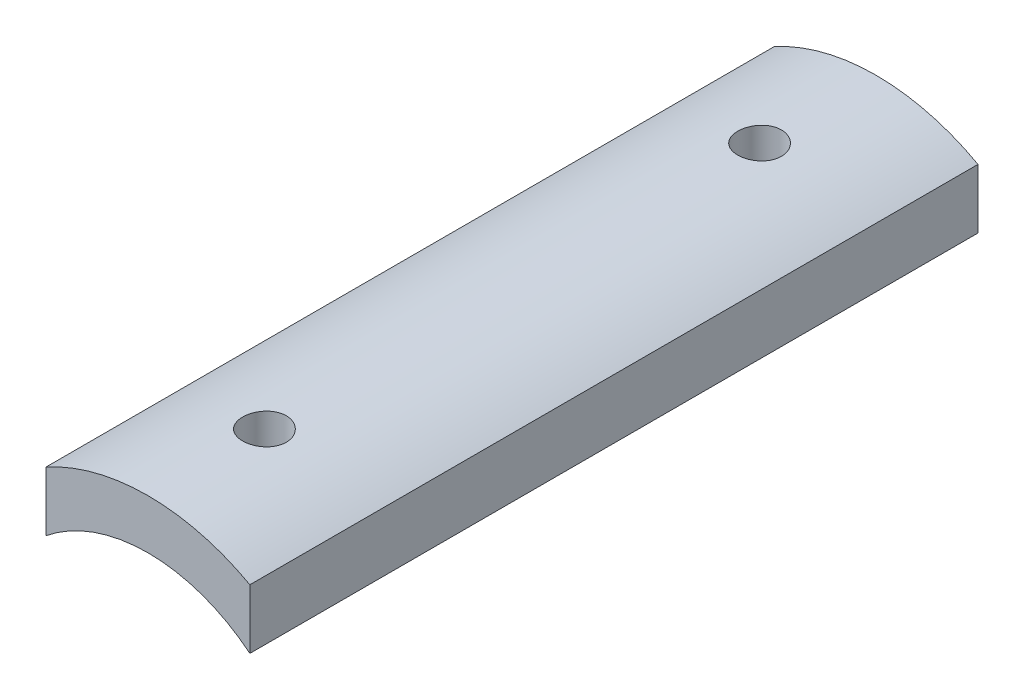
ISO-10303-21;
HEADER;
FILE_DESCRIPTION(('STEP AP214'),'2;1');
FILE_NAME('part.step','',(''),(''),'','','');
FILE_SCHEMA(('AUTOMOTIVE_DESIGN { 1 0 10303 214 1 1 1 1 }'));
ENDSEC;
DATA;
#1=APPLICATION_CONTEXT('core data for automotive mechanical design processes');
#2=APPLICATION_PROTOCOL_DEFINITION('international standard','automotive_design',2000,#1);
#3=PRODUCT_CONTEXT('',#1,'mechanical');
#4=PRODUCT('Part','Part','',(#3));
#5=PRODUCT_RELATED_PRODUCT_CATEGORY('part','',(#4));
#6=PRODUCT_DEFINITION_FORMATION('','',#4);
#7=PRODUCT_DEFINITION_CONTEXT('part definition',#1,'design');
#8=PRODUCT_DEFINITION('design','',#6,#7);
#9=PRODUCT_DEFINITION_SHAPE('','',#8);
#10=(LENGTH_UNIT() NAMED_UNIT(*) SI_UNIT(.MILLI.,.METRE.));
#11=(NAMED_UNIT(*) PLANE_ANGLE_UNIT() SI_UNIT($,.RADIAN.));
#12=(NAMED_UNIT(*) SI_UNIT($,.STERADIAN.) SOLID_ANGLE_UNIT());
#13=UNCERTAINTY_MEASURE_WITH_UNIT(LENGTH_MEASURE(1.E-05),#10,'distance_accuracy_value','');
#14=(GEOMETRIC_REPRESENTATION_CONTEXT(3) GLOBAL_UNCERTAINTY_ASSIGNED_CONTEXT((#13)) GLOBAL_UNIT_ASSIGNED_CONTEXT((#10,
#11,#12)) REPRESENTATION_CONTEXT('',''));
#15=CARTESIAN_POINT('',(0.,0.,0.));
#16=DIRECTION('',(0.,0.,1.));
#17=DIRECTION('',(1.,0.,0.));
#18=AXIS2_PLACEMENT_3D('',#15,#16,#17);
#19=CARTESIAN_POINT('',(0.,0.,50.));
#20=DIRECTION('',(0.,0.,-1.));
#21=DIRECTION('',(-1.,0.,0.));
#22=AXIS2_PLACEMENT_3D('',#19,#20,#21);
#23=CYLINDRICAL_SURFACE('',#22,14.5);
#24=CARTESIAN_POINT('',(0.,0.,0.));
#25=DIRECTION('',(0.,0.,1.));
#26=DIRECTION('',(1.,0.,0.));
#27=AXIS2_PLACEMENT_3D('',#24,#25,#26);
#28=CIRCLE('',#27,14.5);
#29=CARTESIAN_POINT('',(6.99999999999999,12.6984250992003,0.));
#30=VERTEX_POINT('',#29);
#31=CARTESIAN_POINT('',(-7.00000000000001,12.6984250992003,0.));
#32=VERTEX_POINT('',#31);
#33=EDGE_CURVE('E106',#30,#32,#28,.T.);
#34=ORIENTED_EDGE('',*,*,#33,.T.);
#35=DIRECTION('',(0.,0.,-1.));
#36=VECTOR('',#35,1.);
#37=CARTESIAN_POINT('',(-7.00000000000001,12.6984250992003,50.));
#38=LINE('',#37,#36);
#39=CARTESIAN_POINT('',(-7.00000000000001,12.6984250992003,50.));
#40=VERTEX_POINT('',#39);
#41=EDGE_CURVE('E11',#40,#32,#38,.T.);
#42=ORIENTED_EDGE('',*,*,#41,.F.);
#43=CARTESIAN_POINT('',(0.,0.,50.));
#44=DIRECTION('',(0.,0.,1.));
#45=DIRECTION('',(1.,0.,0.));
#46=AXIS2_PLACEMENT_3D('',#43,#44,#45);
#47=CIRCLE('',#46,14.5);
#48=CARTESIAN_POINT('',(6.99999999999999,12.6984250992003,50.));
#49=VERTEX_POINT('',#48);
#50=EDGE_CURVE('E92',#49,#40,#47,.T.);
#51=ORIENTED_EDGE('',*,*,#50,.F.);
#52=DIRECTION('',(0.,0.,-1.));
#53=VECTOR('',#52,1.);
#54=CARTESIAN_POINT('',(6.99999999999999,12.6984250992003,50.));
#55=LINE('',#54,#53);
#56=EDGE_CURVE('E102',#49,#30,#55,.T.);
#57=ORIENTED_EDGE('',*,*,#56,.T.);
#58=EDGE_LOOP('',(#34,#42,#51,#57));
#59=FACE_BOUND('',#58,.T.);
#60=CARTESIAN_POINT('',(0.,14.5,40.5));
#61=CARTESIAN_POINT('',(-0.0840148021741446,14.4999990032491,40.5000036303681));
#62=CARTESIAN_POINT('',(-0.168084771282427,14.4992620586649,40.5070822560206));
#63=CARTESIAN_POINT('',(-0.333892883933664,14.4963931068318,40.5352128131051));
#64=CARTESIAN_POINT('',(-0.415628372949498,14.4942595726645,40.5562800389061));
#65=CARTESIAN_POINT('',(-0.574342532597328,14.4888382191004,40.6117669932428));
#66=CARTESIAN_POINT('',(-0.651324084032495,14.4855511069859,40.6461785414556));
#67=CARTESIAN_POINT('',(-0.798402236017979,14.4781899081878,40.7273611796393));
#68=CARTESIAN_POINT('',(-0.868500178356104,14.4741159753365,40.774129854311));
#69=CARTESIAN_POINT('',(-1.00010681095366,14.465619822026,40.8788916628825));
#70=CARTESIAN_POINT('',(-1.06158536014861,14.4611964599843,40.9369225723858));
#71=CARTESIAN_POINT('',(-1.17394892441817,14.4525093984958,41.0624809009353));
#72=CARTESIAN_POINT('',(-1.22483344358428,14.4482457065309,41.130008764288));
#73=CARTESIAN_POINT('',(-1.31467204769526,14.4403491347822,41.272833793646));
#74=CARTESIAN_POINT('',(-1.35359872412229,14.4367177123463,41.3481482874149));
#75=CARTESIAN_POINT('',(-1.41824164496559,14.4305111289699,41.5042886562265));
#76=CARTESIAN_POINT('',(-1.44395823731332,14.4279359402104,41.5851143860489));
#77=CARTESIAN_POINT('',(-1.48136131906886,14.4241438023454,41.749674680786));
#78=CARTESIAN_POINT('',(-1.49309793186402,14.422922001954,41.8333977394261));
#79=CARTESIAN_POINT('',(-1.50236285600847,14.421959947576,42.001633571609));
#80=CARTESIAN_POINT('',(-1.49989156540124,14.4222196520842,42.0861463229618));
#81=CARTESIAN_POINT('',(-1.48085212496077,14.4241868324816,42.2532165454848));
#82=CARTESIAN_POINT('',(-1.46433876304795,14.4258886814695,42.3357803359061));
#83=CARTESIAN_POINT('',(-1.4177692117002,14.4305396081235,42.4969582916968));
#84=CARTESIAN_POINT('',(-1.38771282778534,14.4334887037002,42.5755724003302));
#85=CARTESIAN_POINT('',(-1.31485014657386,14.4403082989242,42.7267921400184));
#86=CARTESIAN_POINT('',(-1.27201960425428,14.444180547863,42.7993860069221));
#87=CARTESIAN_POINT('',(-1.17484181974967,14.4524086830009,42.9363758349649));
#88=CARTESIAN_POINT('',(-1.12049421672575,14.4567645843512,43.0007715391477));
#89=CARTESIAN_POINT('',(-1.00151933128955,14.4654942918335,43.119855409761));
#90=CARTESIAN_POINT('',(-0.936844744019752,14.4698680854442,43.1744963266817));
#91=CARTESIAN_POINT('',(-0.799215851694551,14.4781213717037,43.2721531390179));
#92=CARTESIAN_POINT('',(-0.72626153633905,14.4820008637376,43.3151690199715));
#93=CARTESIAN_POINT('',(-0.574110894425456,14.4888298378301,43.3883530423487));
#94=CARTESIAN_POINT('',(-0.494913372579218,14.4917791412571,43.4185187164322));
#95=CARTESIAN_POINT('',(-0.332540189971191,14.4964136379257,43.4651110451454));
#96=CARTESIAN_POINT('',(-0.249364656636167,14.4980988716301,43.4815381395489));
#97=CARTESIAN_POINT('',(-0.081805601078329,14.5000101429514,43.5001269002561));
#98=CARTESIAN_POINT('',(0.00257061651872,14.5002428483428,43.5023537532332));
#99=CARTESIAN_POINT('',(0.170495054722027,14.4992407379809,43.4926501321471));
#100=CARTESIAN_POINT('',(0.254043287295834,14.4980059434699,43.4807198630103));
#101=CARTESIAN_POINT('',(0.417751455966306,14.4942118371191,43.4430947439817));
#102=CARTESIAN_POINT('',(0.497918497033814,14.4916554694625,43.4174304860408));
#103=CARTESIAN_POINT('',(0.652809663791429,14.4855049280238,43.3530973878317));
#104=CARTESIAN_POINT('',(0.727533659325789,14.481910729435,43.3144282367108));
#105=CARTESIAN_POINT('',(0.869711877428812,14.4740697722264,43.2250218584248));
#106=CARTESIAN_POINT('',(0.937139091398134,14.4698207214891,43.1742418851988));
#107=CARTESIAN_POINT('',(1.06253616694867,14.4611540091607,43.0621165076298));
#108=CARTESIAN_POINT('',(1.12050577410416,14.4567363430375,43.0007708191422));
#109=CARTESIAN_POINT('',(1.22556904918976,14.4482101718382,42.8689706138183));
#110=CARTESIAN_POINT('',(1.27261988038123,14.4441029256992,42.7984818571161));
#111=CARTESIAN_POINT('',(1.35421534328635,14.4366819790703,42.650564970184));
#112=CARTESIAN_POINT('',(1.3887601563391,14.4333682670743,42.5731369405949));
#113=CARTESIAN_POINT('',(1.44429156258438,14.4279175313779,42.4136852235977));
#114=CARTESIAN_POINT('',(1.46530347606679,14.4257783112962,42.3316704325602));
#115=CARTESIAN_POINT('',(1.49325471535208,14.4229120132457,42.1652535334734));
#116=CARTESIAN_POINT('',(1.50019447567214,14.4221848916743,42.0808514992187));
#117=CARTESIAN_POINT('',(1.49979814281966,14.4222260798376,41.912481786088));
#118=CARTESIAN_POINT('',(1.49252933994875,14.4229873407488,41.8285139390021));
#119=CARTESIAN_POINT('',(1.46406347968093,14.4259044734943,41.6629991890778));
#120=CARTESIAN_POINT('',(1.44286640811144,14.4280603467476,41.5814522887028));
#121=CARTESIAN_POINT('',(1.387164604834,14.4335218078673,41.4230958210283));
#122=CARTESIAN_POINT('',(1.35266201080536,14.4368272110406,41.3462854950438));
#123=CARTESIAN_POINT('',(1.27133543901311,14.444215661305,41.1995352232494));
#124=CARTESIAN_POINT('',(1.22451150198588,14.4482987058251,41.129595254726));
#125=CARTESIAN_POINT('',(1.11961898310018,14.4568055537228,40.9982262238133));
#126=CARTESIAN_POINT('',(1.06150023629107,14.4612308222155,40.9368373096196));
#127=CARTESIAN_POINT('',(0.935768193350421,14.4699101648942,40.8246545220018));
#128=CARTESIAN_POINT('',(0.868152631185756,14.4741641979092,40.7738631844737));
#129=CARTESIAN_POINT('',(0.725147009600981,14.4820336925439,40.684209137661));
#130=CARTESIAN_POINT('',(0.649736651411111,14.4856474168098,40.645378677565));
#131=CARTESIAN_POINT('',(0.493476006261703,14.4918104578477,40.5809838469406));
#132=CARTESIAN_POINT('',(0.412631941056893,14.4943609687084,40.555404586186));
#133=CARTESIAN_POINT('',(0.276112419081801,14.4974725714572,40.5245848613522));
#134=CARTESIAN_POINT('',(0.2213083099583,14.4984159130774,40.5153782153079));
#135=CARTESIAN_POINT('',(0.111010828300255,14.4996799552804,40.5030845988855));
#136=CARTESIAN_POINT('',(0.0555174588614052,14.5000006586587,40.4999976010321));
#137=CARTESIAN_POINT('',(0.,14.5,40.5));
#138=B_SPLINE_CURVE_WITH_KNOTS('',3,(#60,#61,#62,#63,#64,#65,#66,#67,#68,#69,#70,#71,#72,#73,
#74,#75,#76,#77,#78,#79,#80,#81,#82,#83,#84,#85,#86,#87,#88,#89,#90,#91,#92,#93,#94,#95,#96,#97,
#98,#99,#100,#101,#102,#103,#104,#105,#106,#107,#108,#109,#110,#111,#112,#113,#114,#115,#116,
#117,#118,#119,#120,#121,#122,#123,#124,#125,#126,#127,#128,#129,#130,#131,#132,#133,#134,#135,
#136,#137),.UNSPECIFIED.,.T.,.F.,(4,2,2,2,2,2,2,2,2,2,2,2,2,2,2,2,2,2,2,2,2,2,2,2,2,2,2,2,2,2,2,
2,2,2,2,2,2,2,4),(0.,0.251841670392661,0.503959145064459,0.755922310639377,1.00783626438468,
1.26061026177495,1.51339608890355,1.76675707489008,2.02011138743097,2.27255457045027,
2.52499068114734,2.77644635791211,3.02790564573512,3.27984526731005,3.53179278352591,
3.78492937718262,4.0380662857481,4.2912517766954,4.54442916283254,4.79644348815328,
5.04845416557553,5.29990582094917,5.55136348713816,5.80372218105623,6.05608766273409,
6.30942709440746,6.56276285247463,6.81562322728749,7.06847579420858,7.32013377815423,
7.57179201817242,7.82340984334446,8.07502683663736,8.32778801717829,8.58060961179688,
8.83410702060342,9.08731895590207,9.25373811047238,9.42015651786956),.UNSPECIFIED.);
#139=CARTESIAN_POINT('',(0.,14.5,40.5));
#140=VERTEX_POINT('',#139);
#141=EDGE_CURVE('E120',#140,#140,#138,.T.);
#142=ORIENTED_EDGE('',*,*,#141,.F.);
#143=EDGE_LOOP('',(#142));
#144=FACE_BOUND('',#143,.T.);
#145=CARTESIAN_POINT('',(0.,14.5,6.5));
#146=CARTESIAN_POINT('',(-0.0840148021741486,14.4999990032491,6.50000363036809));
#147=CARTESIAN_POINT('',(-0.168084771282431,14.4992620586649,6.50708225602059));
#148=CARTESIAN_POINT('',(-0.333892883933668,14.4963931068318,6.53521281310508));
#149=CARTESIAN_POINT('',(-0.415628372949501,14.4942595726645,6.55628003890612));
#150=CARTESIAN_POINT('',(-0.574342532597331,14.4888382191004,6.61176699324282));
#151=CARTESIAN_POINT('',(-0.651324084032498,14.4855511069859,6.64617854145565));
#152=CARTESIAN_POINT('',(-0.798402236017983,14.4781899081878,6.72736117963933));
#153=CARTESIAN_POINT('',(-0.868500178356108,14.4741159753365,6.77412985431105));
#154=CARTESIAN_POINT('',(-1.00010681095367,14.465619822026,6.87889166288246));
#155=CARTESIAN_POINT('',(-1.06158536014862,14.4611964599843,6.93692257238575));
#156=CARTESIAN_POINT('',(-1.17394892441817,14.4525093984958,7.06248090093532));
#157=CARTESIAN_POINT('',(-1.22483344358428,14.4482457065309,7.13000876428796));
#158=CARTESIAN_POINT('',(-1.31467204769527,14.4403491347822,7.272833793646));
#159=CARTESIAN_POINT('',(-1.3535987241223,14.4367177123463,7.34814828741489));
#160=CARTESIAN_POINT('',(-1.4182416449656,14.4305111289699,7.50428865622646));
#161=CARTESIAN_POINT('',(-1.44395823731333,14.4279359402104,7.5851143860489));
#162=CARTESIAN_POINT('',(-1.48136131906887,14.4241438023454,7.74967468078603));
#163=CARTESIAN_POINT('',(-1.49309793186402,14.422922001954,7.83339773942608));
#164=CARTESIAN_POINT('',(-1.50236285600847,14.421959947576,8.00163357160897));
#165=CARTESIAN_POINT('',(-1.49989156540124,14.4222196520842,8.08614632296183));
#166=CARTESIAN_POINT('',(-1.48085212496077,14.4241868324816,8.25321654548478));
#167=CARTESIAN_POINT('',(-1.46433876304796,14.4258886814695,8.33578033590605));
#168=CARTESIAN_POINT('',(-1.41776921170021,14.4305396081235,8.49695829169678));
#169=CARTESIAN_POINT('',(-1.38771282778534,14.4334887037002,8.57557240033016));
#170=CARTESIAN_POINT('',(-1.31485014657387,14.4403082989242,8.72679214001843));
#171=CARTESIAN_POINT('',(-1.27201960425428,14.444180547863,8.79938600692206));
#172=CARTESIAN_POINT('',(-1.17484181974968,14.4524086830009,8.93637583496487));
#173=CARTESIAN_POINT('',(-1.12049421672576,14.4567645843512,9.00077153914771));
#174=CARTESIAN_POINT('',(-1.00151933128955,14.4654942918335,9.11985540976103));
#175=CARTESIAN_POINT('',(-0.936844744019757,14.4698680854442,9.17449632668174));
#176=CARTESIAN_POINT('',(-0.799215851694554,14.4781213717037,9.27215313901792));
#177=CARTESIAN_POINT('',(-0.726261536339053,14.4820008637376,9.31516901997146));
#178=CARTESIAN_POINT('',(-0.574110894425458,14.4888298378301,9.38835304234869));
#179=CARTESIAN_POINT('',(-0.49491337257922,14.4917791412571,9.4185187164322));
#180=CARTESIAN_POINT('',(-0.332540189971192,14.4964136379257,9.46511104514544));
#181=CARTESIAN_POINT('',(-0.249364656636168,14.4980988716301,9.48153813954887));
#182=CARTESIAN_POINT('',(-0.0818056010783315,14.5000101429514,9.50012690025611));
#183=CARTESIAN_POINT('',(0.002570616518717,14.5002428483428,9.50235375323317));
#184=CARTESIAN_POINT('',(0.170495054722024,14.4992407379809,9.49265013214708));
#185=CARTESIAN_POINT('',(0.25404328729583,14.4980059434699,9.48071986301027));
#186=CARTESIAN_POINT('',(0.417751455966301,14.4942118371191,9.44309474398171));
#187=CARTESIAN_POINT('',(0.497918497033809,14.4916554694625,9.41743048604079));
#188=CARTESIAN_POINT('',(0.652809663791424,14.4855049280238,9.35309738783174));
#189=CARTESIAN_POINT('',(0.727533659325784,14.481910729435,9.31442823671079));
#190=CARTESIAN_POINT('',(0.869711877428809,14.4740697722264,9.22502185842484));
#191=CARTESIAN_POINT('',(0.937139091398131,14.4698207214891,9.17424188519884));
#192=CARTESIAN_POINT('',(1.06253616694867,14.4611540091607,9.06211650762975));
#193=CARTESIAN_POINT('',(1.12050577410415,14.4567363430375,9.00077081914215));
#194=CARTESIAN_POINT('',(1.22556904918975,14.4482101718382,8.8689706138183));
#195=CARTESIAN_POINT('',(1.27261988038122,14.4441029256992,8.7984818571161));
#196=CARTESIAN_POINT('',(1.35421534328634,14.4366819790703,8.65056497018402));
#197=CARTESIAN_POINT('',(1.3887601563391,14.4333682670743,8.57313694059494));
#198=CARTESIAN_POINT('',(1.44429156258438,14.4279175313779,8.41368522359774));
#199=CARTESIAN_POINT('',(1.46530347606679,14.4257783112962,8.33167043256016));
#200=CARTESIAN_POINT('',(1.49325471535208,14.4229120132457,8.16525353347341));
#201=CARTESIAN_POINT('',(1.50019447567213,14.4221848916743,8.08085149921869));
#202=CARTESIAN_POINT('',(1.49979814281966,14.4222260798376,7.91248178608798));
#203=CARTESIAN_POINT('',(1.49252933994874,14.4229873407488,7.82851393900215));
#204=CARTESIAN_POINT('',(1.46406347968092,14.4259044734943,7.66299918907781));
#205=CARTESIAN_POINT('',(1.44286640811144,14.4280603467476,7.5814522887028));
#206=CARTESIAN_POINT('',(1.38716460483399,14.4335218078673,7.42309582102826));
#207=CARTESIAN_POINT('',(1.35266201080535,14.4368272110406,7.34628549504377));
#208=CARTESIAN_POINT('',(1.2713354390131,14.444215661305,7.19953522324938));
#209=CARTESIAN_POINT('',(1.22451150198587,14.4482987058251,7.12959525472599));
#210=CARTESIAN_POINT('',(1.11961898310017,14.4568055537228,6.99822622381329));
#211=CARTESIAN_POINT('',(1.06150023629106,14.4612308222155,6.9368373096196));
#212=CARTESIAN_POINT('',(0.935768193350411,14.4699101648942,6.82465452200178));
#213=CARTESIAN_POINT('',(0.868152631185747,14.4741641979092,6.77386318447367));
#214=CARTESIAN_POINT('',(0.725147009600974,14.4820336925439,6.68420913766097));
#215=CARTESIAN_POINT('',(0.649736651411105,14.4856474168098,6.64537867756498));
#216=CARTESIAN_POINT('',(0.493476006261699,14.4918104578477,6.58098384694065));
#217=CARTESIAN_POINT('',(0.41263194105689,14.4943609687084,6.555404586186));
#218=CARTESIAN_POINT('',(0.276112419081797,14.4974725714572,6.52458486135218));
#219=CARTESIAN_POINT('',(0.221308309958297,14.4984159130774,6.51537821530788));
#220=CARTESIAN_POINT('',(0.111010828300251,14.4996799552804,6.50308459888553));
#221=CARTESIAN_POINT('',(0.0555174588614012,14.5000006586587,6.49999760103213));
#222=CARTESIAN_POINT('',(0.,14.5,6.5));
#223=B_SPLINE_CURVE_WITH_KNOTS('',3,(#145,#146,#147,#148,#149,#150,#151,#152,#153,#154,#155,
#156,#157,#158,#159,#160,#161,#162,#163,#164,#165,#166,#167,#168,#169,#170,#171,#172,#173,#174,
#175,#176,#177,#178,#179,#180,#181,#182,#183,#184,#185,#186,#187,#188,#189,#190,#191,#192,#193,
#194,#195,#196,#197,#198,#199,#200,#201,#202,#203,#204,#205,#206,#207,#208,#209,#210,#211,#212,
#213,#214,#215,#216,#217,#218,#219,#220,#221,#222),.UNSPECIFIED.,.T.,.F.,(4,2,2,2,2,2,2,2,2,2,2,
2,2,2,2,2,2,2,2,2,2,2,2,2,2,2,2,2,2,2,2,2,2,2,2,2,2,2,4),(0.,0.251841670392661,0.50395914506446,
0.755922310639375,1.00783626438468,1.26061026177495,1.51339608890356,1.76675707489008,
2.02011138743097,2.27255457045027,2.52499068114734,2.77644635791211,3.02790564573511,
3.27984526731004,3.53179278352591,3.78492937718261,4.0380662857481,4.2912517766954,
4.54442916283253,4.79644348815328,5.04845416557553,5.29990582094917,5.55136348713815,
5.80372218105622,6.05608766273409,6.30942709440745,6.56276285247463,6.81562322728749,
7.06847579420857,7.32013377815423,7.57179201817242,7.82340984334445,8.07502683663736,
8.3277880171783,8.58060961179688,8.83410702060341,9.08731895590206,9.25373811047237,
9.42015651786955),.UNSPECIFIED.);
#224=CARTESIAN_POINT('',(0.,14.5,6.5));
#225=VERTEX_POINT('',#224);
#226=EDGE_CURVE('E109',#225,#225,#223,.T.);
#227=ORIENTED_EDGE('',*,*,#226,.F.);
#228=EDGE_LOOP('',(#227));
#229=FACE_BOUND('',#228,.T.);
#230=ADVANCED_FACE('F33',(#59,#144,#229),#23,.T.);
#231=CARTESIAN_POINT('',(0.,0.,50.));
#232=DIRECTION('',(0.,0.,-1.));
#233=DIRECTION('',(-1.,0.,0.));
#234=AXIS2_PLACEMENT_3D('',#231,#232,#233);
#235=CYLINDRICAL_SURFACE('',#234,11.1);
#236=CARTESIAN_POINT('',(0.,0.,0.));
#237=DIRECTION('',(0.,0.,-1.));
#238=DIRECTION('',(1.,0.,0.));
#239=AXIS2_PLACEMENT_3D('',#236,#237,#238);
#240=CIRCLE('',#239,11.1);
#241=CARTESIAN_POINT('',(-7.,8.61452262171271,0.));
#242=VERTEX_POINT('',#241);
#243=CARTESIAN_POINT('',(7.,8.61452262171271,0.));
#244=VERTEX_POINT('',#243);
#245=EDGE_CURVE('E74',#242,#244,#240,.T.);
#246=ORIENTED_EDGE('',*,*,#245,.T.);
#247=DIRECTION('',(0.,0.,-1.));
#248=VECTOR('',#247,1.);
#249=CARTESIAN_POINT('',(7.,8.61452262171271,50.));
#250=LINE('',#249,#248);
#251=CARTESIAN_POINT('',(7.,8.61452262171271,50.));
#252=VERTEX_POINT('',#251);
#253=EDGE_CURVE('E97',#252,#244,#250,.T.);
#254=ORIENTED_EDGE('',*,*,#253,.F.);
#255=CARTESIAN_POINT('',(0.,0.,50.));
#256=DIRECTION('',(0.,0.,-1.));
#257=DIRECTION('',(1.,0.,0.));
#258=AXIS2_PLACEMENT_3D('',#255,#256,#257);
#259=CIRCLE('',#258,11.1);
#260=CARTESIAN_POINT('',(-7.,8.61452262171271,50.));
#261=VERTEX_POINT('',#260);
#262=EDGE_CURVE('E90',#261,#252,#259,.T.);
#263=ORIENTED_EDGE('',*,*,#262,.F.);
#264=DIRECTION('',(0.,0.,-1.));
#265=VECTOR('',#264,1.);
#266=CARTESIAN_POINT('',(-7.,8.61452262171271,50.));
#267=LINE('',#266,#265);
#268=EDGE_CURVE('E48',#261,#242,#267,.T.);
#269=ORIENTED_EDGE('',*,*,#268,.T.);
#270=EDGE_LOOP('',(#246,#254,#263,#269));
#271=FACE_BOUND('',#270,.T.);
#272=CARTESIAN_POINT('',(0.,11.1,40.5));
#273=CARTESIAN_POINT('',(0.0838458451703706,11.0999987553147,40.5000035247285));
#274=CARTESIAN_POINT('',(0.167742651700156,11.0990399791242,40.5070538415379));
#275=CARTESIAN_POINT('',(0.33319767870162,11.0953074729509,40.5350653618542));
#276=CARTESIAN_POINT('',(0.414753432405991,11.0925318969583,40.5560407145883));
#277=CARTESIAN_POINT('',(0.573107420197506,11.0854781791691,40.6112695843236));
#278=CARTESIAN_POINT('',(0.649908964377296,11.08120109695,40.6455137396069));
#279=CARTESIAN_POINT('',(0.796661858391048,11.0716188782229,40.7262867142423));
#280=CARTESIAN_POINT('',(0.866614294465855,11.066313905133,40.7728135812655));
#281=CARTESIAN_POINT('',(0.998143993326624,11.0552293672382,40.8771488123043));
#282=CARTESIAN_POINT('',(1.05967113745556,11.0494472647707,40.935020095076));
#283=CARTESIAN_POINT('',(1.17217177140175,11.0380803749951,41.0602661522326));
#284=CARTESIAN_POINT('',(1.22314469783794,11.0324955982333,41.1276414336156));
#285=CARTESIAN_POINT('',(1.31328004069893,11.0221308923528,41.2703131076284));
#286=CARTESIAN_POINT('',(1.35239488597157,11.0173542381615,41.3456398126344));
#287=CARTESIAN_POINT('',(1.41739986704691,11.009180601324,41.5018685274292));
#288=CARTESIAN_POINT('',(1.44329058770366,11.0057835576641,41.5827702904741));
#289=CARTESIAN_POINT('',(1.48095872106404,11.0007783261886,41.7473295324052));
#290=CARTESIAN_POINT('',(1.49282125317361,10.9991593538176,41.830967193343));
#291=CARTESIAN_POINT('',(1.50235978234195,10.9978606848326,41.999060560255));
#292=CARTESIAN_POINT('',(1.50003644314519,10.9981808974859,42.0835162277709));
#293=CARTESIAN_POINT('',(1.4813389319707,11.0007145501021,42.2502519273513));
#294=CARTESIAN_POINT('',(1.46505891845063,11.0029153027123,42.332542738549));
#295=CARTESIAN_POINT('',(1.41905728503082,11.00894226851,42.4932137175806));
#296=CARTESIAN_POINT('',(1.38933535103005,11.012768519681,42.5715937939838));
#297=CARTESIAN_POINT('',(1.31719363067558,11.0216296078333,42.7225085764773));
#298=CARTESIAN_POINT('',(1.27473332550506,11.0266682910994,42.7950236783123));
#299=CARTESIAN_POINT('',(1.17834908952824,11.037383618502,42.9319351124928));
#300=CARTESIAN_POINT('',(1.1244245465577,11.0430602966983,42.9963310109987));
#301=CARTESIAN_POINT('',(1.00612263502786,11.054468271037,43.1157222929194));
#302=CARTESIAN_POINT('',(0.941664184171821,11.0601996373232,43.1706373590412));
#303=CARTESIAN_POINT('',(0.804402280940977,11.0710283426652,43.2688814253525));
#304=CARTESIAN_POINT('',(0.731598803372561,11.0761256798068,43.3122103905623));
#305=CARTESIAN_POINT('',(0.579648584765708,11.0851159434019,43.3860539196839));
#306=CARTESIAN_POINT('',(0.500499149771717,11.0890083549012,43.4165630066956));
#307=CARTESIAN_POINT('',(0.33813622343553,11.0951456905526,43.4638346587154));
#308=CARTESIAN_POINT('',(0.254922954956907,11.0973907049411,43.4805979766565));
#309=CARTESIAN_POINT('',(0.0874884516148261,11.0999684819753,43.4997971076305));
#310=CARTESIAN_POINT('',(0.00328011214718193,11.1003159996237,43.5023434756838));
#311=CARTESIAN_POINT('',(-0.164362186885839,11.0990995909998,43.4933288303625));
#312=CARTESIAN_POINT('',(-0.247796165744926,11.0975357124807,43.4817681694299));
#313=CARTESIAN_POINT('',(-0.411191818776858,11.0926813865399,43.4449595146651));
#314=CARTESIAN_POINT('',(-0.49116568376747,11.0893976459497,43.4197646765345));
#315=CARTESIAN_POINT('',(-0.645753530077416,11.0814709591148,43.3564584235147));
#316=CARTESIAN_POINT('',(-0.720367301778011,11.0768279597493,43.3183465038064));
#317=CARTESIAN_POINT('',(-0.862607788062021,11.0666629603574,43.230023586004));
#318=CARTESIAN_POINT('',(-0.930190055737664,11.0611358703514,43.1797416040996));
#319=CARTESIAN_POINT('',(-1.05599585118223,11.0498357398514,43.0686056874038));
#320=CARTESIAN_POINT('',(-1.11421894176327,11.0440626878838,43.0077512590261));
#321=CARTESIAN_POINT('',(-1.22004976080499,11.0328752759015,42.876708857708));
#322=CARTESIAN_POINT('',(-1.26758388080053,11.027463573374,42.8064611775381));
#323=CARTESIAN_POINT('',(-1.35017772781974,11.0176566160885,42.6589139145314));
#324=CARTESIAN_POINT('',(-1.38523773965051,11.0132613381246,42.5816144927496));
#325=CARTESIAN_POINT('',(-1.44177091450826,11.0060034552868,42.422388562881));
#326=CARTESIAN_POINT('',(-1.46328451325399,11.0031362929972,42.3404766282133));
#327=CARTESIAN_POINT('',(-1.49224384227734,10.9992465814742,42.1741612442223));
#328=CARTESIAN_POINT('',(-1.49969034721264,10.9982239306661,42.0897579323562));
#329=CARTESIAN_POINT('',(-1.50028827293583,10.9981423212771,41.9215884771429));
#330=CARTESIAN_POINT('',(-1.49355536379783,10.9990674732709,41.8378227294696));
#331=CARTESIAN_POINT('',(-1.46623165377874,11.0027429254894,41.6726256281201));
#332=CARTESIAN_POINT('',(-1.4456408596863,11.0054932248201,41.5911942733004));
#333=CARTESIAN_POINT('',(-1.39122390258806,11.0125039212952,41.4329992286064));
#334=CARTESIAN_POINT('',(-1.35740428719535,11.0167635712876,41.3562332512842));
#335=CARTESIAN_POINT('',(-1.27750107444041,11.0263141118535,41.2094467930398));
#336=CARTESIAN_POINT('',(-1.23141722174895,11.0316050238964,41.1394264525963));
#337=CARTESIAN_POINT('',(-1.12786780837665,11.0426735417186,41.0075288708597));
#338=CARTESIAN_POINT('',(-1.07031620971235,11.048454624251,40.9457194615629));
#339=CARTESIAN_POINT('',(-0.945645912289623,11.0598220322152,40.832592728987));
#340=CARTESIAN_POINT('',(-0.878524974738488,11.0654083116902,40.7812778678165));
#341=CARTESIAN_POINT('',(-0.736275511158812,11.0757845074465,40.6903986659244));
#342=CARTESIAN_POINT('',(-0.661112767229219,11.0805707791873,40.6508874883694));
#343=CARTESIAN_POINT('',(-0.505193306709944,11.0887713444947,40.5851063310774));
#344=CARTESIAN_POINT('',(-0.424442665117265,11.0921871014009,40.5588222207394));
#345=CARTESIAN_POINT('',(-0.286078942432822,11.0964550249337,40.5264076144328));
#346=CARTESIAN_POINT('',(-0.22933175559331,11.0977777807962,40.5165193324906));
#347=CARTESIAN_POINT('',(-0.115064375726852,11.0995506914513,40.5033143458533));
#348=CARTESIAN_POINT('',(-0.0575441897874843,11.1000008542392,40.4999975809458));
#349=CARTESIAN_POINT('',(0.,11.1,40.5));
#350=B_SPLINE_CURVE_WITH_KNOTS('',3,(#272,#273,#274,#275,#276,#277,#278,#279,#280,#281,#282,
#283,#284,#285,#286,#287,#288,#289,#290,#291,#292,#293,#294,#295,#296,#297,#298,#299,#300,#301,
#302,#303,#304,#305,#306,#307,#308,#309,#310,#311,#312,#313,#314,#315,#316,#317,#318,#319,#320,
#321,#322,#323,#324,#325,#326,#327,#328,#329,#330,#331,#332,#333,#334,#335,#336,#337,#338,#339,
#340,#341,#342,#343,#344,#345,#346,#347,#348,#349),.UNSPECIFIED.,.T.,.F.,(4,2,2,2,2,2,2,2,2,2,2,
2,2,2,2,2,2,2,2,2,2,2,2,2,2,2,2,2,2,2,2,2,2,2,2,2,2,2,4),(0.,0.251327314087885,0.50291039349079,
0.754316292339646,1.00568225442482,1.25848394581192,1.51129912820247,1.76511550415781,
2.01892065378262,2.27117774612415,2.52342303566795,2.77397982972466,3.02454247891319,
3.27591073578455,3.5272924185226,3.78070904375822,4.034126434078,4.28765197940798,
4.54116363679206,4.79270114081234,5.04423236069212,5.29478992506378,5.54535728273538,
5.79742290879956,6.04950030598785,6.30326378801229,6.55702147577265,6.81001806665827,
7.06300072492459,7.31392764741245,7.56485444697719,7.81565720700342,8.0664651889023,
8.31923098796615,8.57205602013889,8.82600316576672,9.0796784382496,9.25216831114888,
9.42465660357729),.UNSPECIFIED.);
#351=CARTESIAN_POINT('',(0.,11.1,40.5));
#352=VERTEX_POINT('',#351);
#353=EDGE_CURVE('E114',#352,#352,#350,.T.);
#354=ORIENTED_EDGE('',*,*,#353,.F.);
#355=EDGE_LOOP('',(#354));
#356=FACE_BOUND('',#355,.T.);
#357=CARTESIAN_POINT('',(0.,11.1,6.5));
#358=CARTESIAN_POINT('',(0.0838458451703663,11.0999987553147,6.50000352472849));
#359=CARTESIAN_POINT('',(0.167742651700151,11.0990399791242,6.50705384153789));
#360=CARTESIAN_POINT('',(0.333197678701615,11.0953074729509,6.53506536185422));
#361=CARTESIAN_POINT('',(0.414753432405987,11.0925318969583,6.55604071458826));
#362=CARTESIAN_POINT('',(0.573107420197501,11.0854781791691,6.61126958432362));
#363=CARTESIAN_POINT('',(0.649908964377291,11.08120109695,6.64551373960694));
#364=CARTESIAN_POINT('',(0.796661858391043,11.0716188782229,6.72628671424229));
#365=CARTESIAN_POINT('',(0.86661429446585,11.066313905133,6.77281358126553));
#366=CARTESIAN_POINT('',(0.99814399332662,11.0552293672382,6.87714881230426));
#367=CARTESIAN_POINT('',(1.05967113745556,11.0494472647707,6.93502009507601));
#368=CARTESIAN_POINT('',(1.17217177140175,11.0380803749951,7.06026615223263));
#369=CARTESIAN_POINT('',(1.22314469783794,11.0324955982333,7.12764143361559));
#370=CARTESIAN_POINT('',(1.31328004069892,11.0221308923528,7.27031310762838));
#371=CARTESIAN_POINT('',(1.35239488597156,11.0173542381615,7.34563981263441));
#372=CARTESIAN_POINT('',(1.4173998670469,11.009180601324,7.50186852742917));
#373=CARTESIAN_POINT('',(1.44329058770366,11.0057835576641,7.58277029047411));
#374=CARTESIAN_POINT('',(1.48095872106403,11.0007783261886,7.74732953240521));
#375=CARTESIAN_POINT('',(1.49282125317361,10.9991593538176,7.83096719334296));
#376=CARTESIAN_POINT('',(1.50235978234194,10.9978606848326,7.99906056025499));
#377=CARTESIAN_POINT('',(1.50003644314518,10.9981808974859,8.08351622777085));
#378=CARTESIAN_POINT('',(1.48133893197069,11.0007145501021,8.25025192735126));
#379=CARTESIAN_POINT('',(1.46505891845062,11.0029153027122,8.33254273854896));
#380=CARTESIAN_POINT('',(1.41905728503082,11.00894226851,8.49321371758058));
#381=CARTESIAN_POINT('',(1.38933535103004,11.012768519681,8.57159379398377));
#382=CARTESIAN_POINT('',(1.31719363067558,11.0216296078333,8.72250857647733));
#383=CARTESIAN_POINT('',(1.27473332550505,11.0266682910994,8.79502367831228));
#384=CARTESIAN_POINT('',(1.17834908952824,11.037383618502,8.93193511249277));
#385=CARTESIAN_POINT('',(1.12442454655769,11.0430602966983,8.99633101099866));
#386=CARTESIAN_POINT('',(1.00612263502785,11.054468271037,9.11572229291943));
#387=CARTESIAN_POINT('',(0.941664184171816,11.0601996373232,9.17063735904117));
#388=CARTESIAN_POINT('',(0.804402280940971,11.0710283426652,9.26888142535248));
#389=CARTESIAN_POINT('',(0.731598803372554,11.0761256798068,9.31221039056232));
#390=CARTESIAN_POINT('',(0.5796485847657,11.0851159434019,9.38605391968391));
#391=CARTESIAN_POINT('',(0.500499149771711,11.0890083549012,9.41656300669558));
#392=CARTESIAN_POINT('',(0.338136223435525,11.0951456905526,9.46383465871537));
#393=CARTESIAN_POINT('',(0.254922954956903,11.0973907049411,9.48059797665647));
#394=CARTESIAN_POINT('',(0.0874884516148228,11.0999684819753,9.49979710763052));
#395=CARTESIAN_POINT('',(0.00328011214717872,11.1003159996237,9.50234347568376));
#396=CARTESIAN_POINT('',(-0.164362186885842,11.0990995909998,9.4933288303625));
#397=CARTESIAN_POINT('',(-0.247796165744929,11.0975357124807,9.48176816942995));
#398=CARTESIAN_POINT('',(-0.411191818776861,11.0926813865399,9.44495951466514));
#399=CARTESIAN_POINT('',(-0.491165683767473,11.0893976459497,9.41976467653445));
#400=CARTESIAN_POINT('',(-0.645753530077419,11.0814709591148,9.35645842351466));
#401=CARTESIAN_POINT('',(-0.720367301778014,11.0768279597493,9.31834650380635));
#402=CARTESIAN_POINT('',(-0.862607788062025,11.0666629603574,9.23002358600403));
#403=CARTESIAN_POINT('',(-0.930190055737669,11.0611358703514,9.17974160409961));
#404=CARTESIAN_POINT('',(-1.05599585118224,11.0498357398514,9.06860568740377));
#405=CARTESIAN_POINT('',(-1.11421894176328,11.0440626878838,9.00775125902608));
#406=CARTESIAN_POINT('',(-1.220049760805,11.0328752759015,8.87670885770801));
#407=CARTESIAN_POINT('',(-1.26758388080053,11.027463573374,8.80646117753811));
#408=CARTESIAN_POINT('',(-1.35017772781975,11.0176566160885,8.65891391453141));
#409=CARTESIAN_POINT('',(-1.38523773965051,11.0132613381246,8.58161449274963));
#410=CARTESIAN_POINT('',(-1.44177091450826,11.0060034552868,8.42238856288102));
#411=CARTESIAN_POINT('',(-1.463284513254,11.0031362929972,8.34047662821325));
#412=CARTESIAN_POINT('',(-1.49224384227735,10.9992465814742,8.1741612442223));
#413=CARTESIAN_POINT('',(-1.49969034721264,10.9982239306661,8.08975793235621));
#414=CARTESIAN_POINT('',(-1.50028827293583,10.9981423212771,7.92158847714291));
#415=CARTESIAN_POINT('',(-1.49355536379784,10.9990674732709,7.83782272946955));
#416=CARTESIAN_POINT('',(-1.46623165377875,11.0027429254894,7.67262562812006));
#417=CARTESIAN_POINT('',(-1.4456408596863,11.0054932248201,7.59119427330037));
#418=CARTESIAN_POINT('',(-1.39122390258807,11.0125039212952,7.43299922860638));
#419=CARTESIAN_POINT('',(-1.35740428719536,11.0167635712876,7.35623325128422));
#420=CARTESIAN_POINT('',(-1.27750107444042,11.0263141118535,7.20944679303979));
#421=CARTESIAN_POINT('',(-1.23141722174896,11.0316050238964,7.13942645259631));
#422=CARTESIAN_POINT('',(-1.12786780837665,11.0426735417186,7.0075288708597));
#423=CARTESIAN_POINT('',(-1.07031620971236,11.048454624251,6.94571946156288));
#424=CARTESIAN_POINT('',(-0.945645912289628,11.0598220322152,6.83259272898701));
#425=CARTESIAN_POINT('',(-0.878524974738491,11.0654083116902,6.78127786781649));
#426=CARTESIAN_POINT('',(-0.736275511158815,11.0757845074465,6.69039866592438));
#427=CARTESIAN_POINT('',(-0.661112767229223,11.0805707791873,6.65088748836939));
#428=CARTESIAN_POINT('',(-0.505193306709948,11.0887713444947,6.58510633107742));
#429=CARTESIAN_POINT('',(-0.42444266511727,11.0921871014009,6.55882222073943));
#430=CARTESIAN_POINT('',(-0.286078942432826,11.0964550249337,6.52640761443278));
#431=CARTESIAN_POINT('',(-0.229331755593314,11.0977777807962,6.51651933249058));
#432=CARTESIAN_POINT('',(-0.115064375726856,11.0995506914513,6.50331434585332));
#433=CARTESIAN_POINT('',(-0.0575441897874884,11.1000008542392,6.49999758094579));
#434=CARTESIAN_POINT('',(0.,11.1,6.5));
#435=B_SPLINE_CURVE_WITH_KNOTS('',3,(#357,#358,#359,#360,#361,#362,#363,#364,#365,#366,#367,
#368,#369,#370,#371,#372,#373,#374,#375,#376,#377,#378,#379,#380,#381,#382,#383,#384,#385,#386,
#387,#388,#389,#390,#391,#392,#393,#394,#395,#396,#397,#398,#399,#400,#401,#402,#403,#404,#405,
#406,#407,#408,#409,#410,#411,#412,#413,#414,#415,#416,#417,#418,#419,#420,#421,#422,#423,#424,
#425,#426,#427,#428,#429,#430,#431,#432,#433,#434),.UNSPECIFIED.,.T.,.F.,(4,2,2,2,2,2,2,2,2,2,2,
2,2,2,2,2,2,2,2,2,2,2,2,2,2,2,2,2,2,2,2,2,2,2,2,2,2,2,4),(0.,0.251327314087884,
0.502910393490789,0.754316292339646,1.00568225442482,1.25848394581192,1.51129912820246,
1.7651155041578,2.01892065378261,2.27117774612414,2.52342303566795,2.77397982972466,
3.02454247891319,3.27591073578455,3.52729241852259,3.78070904375822,4.034126434078,
4.28765197940798,4.54116363679205,4.79270114081234,5.04423236069212,5.29478992506378,
5.54535728273538,5.79742290879956,6.04950030598784,6.30326378801228,6.55702147577265,
6.81001806665827,7.06300072492459,7.31392764741245,7.56485444697718,7.81565720700341,
8.06646518890229,8.31923098796615,8.57205602013889,8.82600316576671,9.0796784382496,
9.25216831114888,9.42465660357728),.UNSPECIFIED.);
#436=CARTESIAN_POINT('',(0.,11.1,6.5));
#437=VERTEX_POINT('',#436);
#438=EDGE_CURVE('E37',#437,#437,#435,.T.);
#439=ORIENTED_EDGE('',*,*,#438,.F.);
#440=EDGE_LOOP('',(#439));
#441=FACE_BOUND('',#440,.T.);
#442=ADVANCED_FACE('F99',(#271,#356,#441),#235,.F.);
#443=CARTESIAN_POINT('',(-7.00000000000001,12.6984250992003,50.));
#444=DIRECTION('',(1.,0.,0.));
#445=DIRECTION('',(0.,1.,0.));
#446=AXIS2_PLACEMENT_3D('',#443,#444,#445);
#447=PLANE('',#446);
#448=DIRECTION('',(0.,-1.,0.));
#449=VECTOR('',#448,1.);
#450=CARTESIAN_POINT('',(-7.00000000000001,12.6984250992003,0.));
#451=LINE('',#450,#449);
#452=EDGE_CURVE('E96',#32,#242,#451,.T.);
#453=ORIENTED_EDGE('',*,*,#452,.T.);
#454=ORIENTED_EDGE('',*,*,#268,.F.);
#455=DIRECTION('',(0.,-1.,0.));
#456=VECTOR('',#455,1.);
#457=CARTESIAN_POINT('',(-7.00000000000001,12.6984250992003,50.));
#458=LINE('',#457,#456);
#459=EDGE_CURVE('E87',#40,#261,#458,.T.);
#460=ORIENTED_EDGE('',*,*,#459,.F.);
#461=ORIENTED_EDGE('',*,*,#41,.T.);
#462=EDGE_LOOP('',(#453,#454,#460,#461));
#463=FACE_BOUND('',#462,.T.);
#464=ADVANCED_FACE('F95',(#463),#447,.F.);
#465=CARTESIAN_POINT('',(6.99999999999999,12.6984250992003,50.));
#466=DIRECTION('',(-1.,0.,0.));
#467=DIRECTION('',(0.,-1.,0.));
#468=AXIS2_PLACEMENT_3D('',#465,#466,#467);
#469=PLANE('',#468);
#470=DIRECTION('',(0.,1.,0.));
#471=VECTOR('',#470,1.);
#472=CARTESIAN_POINT('',(6.99999999999999,12.6984250992003,0.));
#473=LINE('',#472,#471);
#474=EDGE_CURVE('E80',#244,#30,#473,.T.);
#475=ORIENTED_EDGE('',*,*,#474,.T.);
#476=ORIENTED_EDGE('',*,*,#56,.F.);
#477=DIRECTION('',(0.,1.,0.));
#478=VECTOR('',#477,1.);
#479=CARTESIAN_POINT('',(6.99999999999999,12.6984250992003,50.));
#480=LINE('',#479,#478);
#481=EDGE_CURVE('E57',#252,#49,#480,.T.);
#482=ORIENTED_EDGE('',*,*,#481,.F.);
#483=ORIENTED_EDGE('',*,*,#253,.T.);
#484=EDGE_LOOP('',(#475,#476,#482,#483));
#485=FACE_BOUND('',#484,.T.);
#486=ADVANCED_FACE('F154',(#485),#469,.F.);
#487=CARTESIAN_POINT('',(0.,0.,50.));
#488=DIRECTION('',(0.,0.,1.));
#489=DIRECTION('',(1.,0.,0.));
#490=AXIS2_PLACEMENT_3D('',#487,#488,#489);
#491=PLANE('',#490);
#492=ORIENTED_EDGE('',*,*,#50,.T.);
#493=ORIENTED_EDGE('',*,*,#459,.T.);
#494=ORIENTED_EDGE('',*,*,#262,.T.);
#495=ORIENTED_EDGE('',*,*,#481,.T.);
#496=EDGE_LOOP('',(#492,#493,#494,#495));
#497=FACE_BOUND('',#496,.T.);
#498=ADVANCED_FACE('F88',(#497),#491,.T.);
#499=CARTESIAN_POINT('',(0.,0.,0.));
#500=DIRECTION('',(0.,0.,1.));
#501=DIRECTION('',(1.,0.,0.));
#502=AXIS2_PLACEMENT_3D('',#499,#500,#501);
#503=PLANE('',#502);
#504=ORIENTED_EDGE('',*,*,#33,.F.);
#505=ORIENTED_EDGE('',*,*,#474,.F.);
#506=ORIENTED_EDGE('',*,*,#245,.F.);
#507=ORIENTED_EDGE('',*,*,#452,.F.);
#508=EDGE_LOOP('',(#504,#505,#506,#507));
#509=FACE_BOUND('',#508,.T.);
#510=ADVANCED_FACE('F128',(#509),#503,.F.);
#511=CARTESIAN_POINT('',(0.,8.61452262171271,42.));
#512=DIRECTION('',(0.,-1.,0.));
#513=DIRECTION('',(0.,0.,-1.));
#514=AXIS2_PLACEMENT_3D('',#511,#512,#513);
#515=CYLINDRICAL_SURFACE('',#514,1.5);
#516=ORIENTED_EDGE('',*,*,#353,.T.);
#517=EDGE_LOOP('',(#516));
#518=FACE_BOUND('',#517,.T.);
#519=ORIENTED_EDGE('',*,*,#141,.T.);
#520=EDGE_LOOP('',(#519));
#521=FACE_BOUND('',#520,.T.);
#522=ADVANCED_FACE('F123',(#518,#521),#515,.F.);
#523=CARTESIAN_POINT('',(0.,8.61452262171271,8.));
#524=DIRECTION('',(0.,-1.,0.));
#525=DIRECTION('',(0.,0.,-1.));
#526=AXIS2_PLACEMENT_3D('',#523,#524,#525);
#527=CYLINDRICAL_SURFACE('',#526,1.5);
#528=ORIENTED_EDGE('',*,*,#438,.T.);
#529=EDGE_LOOP('',(#528));
#530=FACE_BOUND('',#529,.T.);
#531=ORIENTED_EDGE('',*,*,#226,.T.);
#532=EDGE_LOOP('',(#531));
#533=FACE_BOUND('',#532,.T.);
#534=ADVANCED_FACE('F127',(#530,#533),#527,.F.);
#535=CLOSED_SHELL('',(#230,#442,#464,#486,#498,#510,#522,#534));
#536=MANIFOLD_SOLID_BREP('B2',#535);
#537=ADVANCED_BREP_SHAPE_REPRESENTATION('',(#18,#536),#14);
#538=SHAPE_DEFINITION_REPRESENTATION(#9,#537);
ENDSEC;
END-ISO-10303-21;
